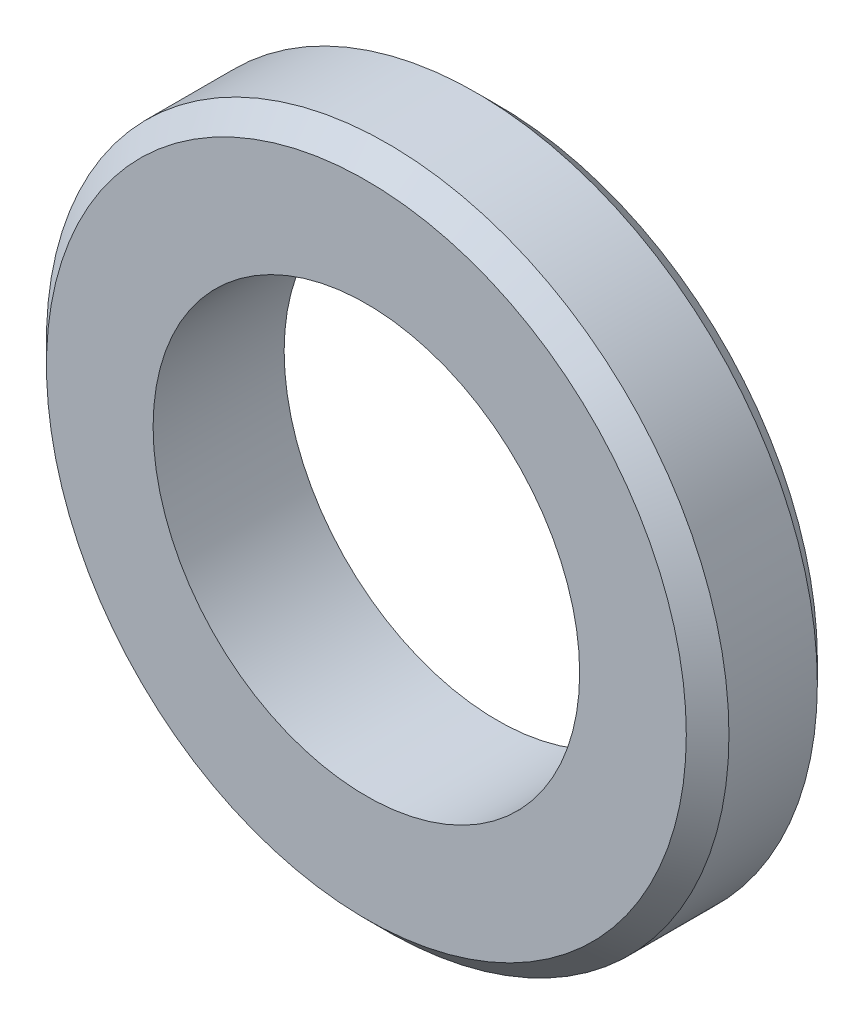
ISO-10303-21;
HEADER;
FILE_DESCRIPTION(('STEP AP214'),'2;1');
FILE_NAME('part.step','',(''),(''),'','','');
FILE_SCHEMA(('AUTOMOTIVE_DESIGN { 1 0 10303 214 1 1 1 1 }'));
ENDSEC;
DATA;
#1=APPLICATION_CONTEXT('core data for automotive mechanical design processes');
#2=APPLICATION_PROTOCOL_DEFINITION('international standard','automotive_design',2000,#1);
#3=PRODUCT_CONTEXT('',#1,'mechanical');
#4=PRODUCT('Part','Part','',(#3));
#5=PRODUCT_RELATED_PRODUCT_CATEGORY('part','',(#4));
#6=PRODUCT_DEFINITION_FORMATION('','',#4);
#7=PRODUCT_DEFINITION_CONTEXT('part definition',#1,'design');
#8=PRODUCT_DEFINITION('design','',#6,#7);
#9=PRODUCT_DEFINITION_SHAPE('','',#8);
#10=(LENGTH_UNIT() NAMED_UNIT(*) SI_UNIT(.MILLI.,.METRE.));
#11=(NAMED_UNIT(*) PLANE_ANGLE_UNIT() SI_UNIT($,.RADIAN.));
#12=(NAMED_UNIT(*) SI_UNIT($,.STERADIAN.) SOLID_ANGLE_UNIT());
#13=UNCERTAINTY_MEASURE_WITH_UNIT(LENGTH_MEASURE(1.E-05),#10,'distance_accuracy_value','');
#14=(GEOMETRIC_REPRESENTATION_CONTEXT(3) GLOBAL_UNCERTAINTY_ASSIGNED_CONTEXT((#13)) GLOBAL_UNIT_ASSIGNED_CONTEXT((#10,
#11,#12)) REPRESENTATION_CONTEXT('',''));
#15=CARTESIAN_POINT('',(0.,0.,0.));
#16=DIRECTION('',(0.,0.,1.));
#17=DIRECTION('',(1.,0.,0.));
#18=AXIS2_PLACEMENT_3D('',#15,#16,#17);
#19=CARTESIAN_POINT('',(0.,0.,4.8768));
#20=DIRECTION('',(0.,0.,1.));
#21=DIRECTION('',(1.,0.,0.));
#22=AXIS2_PLACEMENT_3D('',#19,#20,#21);
#23=PLANE('',#22);
#24=CARTESIAN_POINT('',(0.,0.,4.8768));
#25=DIRECTION('',(0.,0.,1.));
#26=DIRECTION('',(1.,0.,0.));
#27=AXIS2_PLACEMENT_3D('',#24,#25,#26);
#28=CIRCLE('',#27,11.90625);
#29=CARTESIAN_POINT('',(11.90625,0.,4.8768));
#30=VERTEX_POINT('',#29);
#31=EDGE_CURVE('E10',#30,#30,#28,.T.);
#32=ORIENTED_EDGE('',*,*,#31,.T.);
#33=EDGE_LOOP('',(#32));
#34=FACE_BOUND('',#33,.T.);
#35=CARTESIAN_POINT('',(0.,0.,4.8768));
#36=DIRECTION('',(0.,0.,1.));
#37=DIRECTION('',(1.,0.,0.));
#38=AXIS2_PLACEMENT_3D('',#35,#36,#37);
#39=CIRCLE('',#38,7.9375);
#40=CARTESIAN_POINT('',(7.9375,0.,4.8768));
#41=VERTEX_POINT('',#40);
#42=EDGE_CURVE('E63',#41,#41,#39,.T.);
#43=ORIENTED_EDGE('',*,*,#42,.F.);
#44=EDGE_LOOP('',(#43));
#45=FACE_BOUND('',#44,.T.);
#46=ADVANCED_FACE('F42',(#34,#45),#23,.T.);
#47=CARTESIAN_POINT('',(0.,0.,0.));
#48=DIRECTION('',(0.,0.,1.));
#49=DIRECTION('',(1.,0.,0.));
#50=AXIS2_PLACEMENT_3D('',#47,#48,#49);
#51=PLANE('',#50);
#52=CARTESIAN_POINT('',(0.,0.,0.));
#53=DIRECTION('',(0.,0.,1.));
#54=DIRECTION('',(1.,0.,0.));
#55=AXIS2_PLACEMENT_3D('',#52,#53,#54);
#56=CIRCLE('',#55,11.90625);
#57=CARTESIAN_POINT('',(11.90625,0.,0.));
#58=VERTEX_POINT('',#57);
#59=EDGE_CURVE('E50',#58,#58,#56,.F.);
#60=ORIENTED_EDGE('',*,*,#59,.T.);
#61=EDGE_LOOP('',(#60));
#62=FACE_BOUND('',#61,.T.);
#63=CARTESIAN_POINT('',(0.,0.,0.));
#64=DIRECTION('',(0.,0.,1.));
#65=DIRECTION('',(1.,0.,0.));
#66=AXIS2_PLACEMENT_3D('',#63,#64,#65);
#67=CIRCLE('',#66,7.9375);
#68=CARTESIAN_POINT('',(7.9375,0.,0.));
#69=VERTEX_POINT('',#68);
#70=EDGE_CURVE('E64',#69,#69,#67,.T.);
#71=ORIENTED_EDGE('',*,*,#70,.T.);
#72=EDGE_LOOP('',(#71));
#73=FACE_BOUND('',#72,.T.);
#74=ADVANCED_FACE('F74',(#62,#73),#51,.F.);
#75=CARTESIAN_POINT('',(0.,0.,4.8768));
#76=DIRECTION('',(0.,0.,-1.));
#77=DIRECTION('',(-1.,0.,0.));
#78=AXIS2_PLACEMENT_3D('',#75,#76,#77);
#79=CYLINDRICAL_SURFACE('',#78,12.7);
#80=CARTESIAN_POINT('',(0.,0.,0.793750000000005));
#81=DIRECTION('',(0.,0.,1.));
#82=DIRECTION('',(1.,0.,0.));
#83=AXIS2_PLACEMENT_3D('',#80,#81,#82);
#84=CIRCLE('',#83,12.7);
#85=CARTESIAN_POINT('',(12.7,0.,0.793750000000005));
#86=VERTEX_POINT('',#85);
#87=EDGE_CURVE('E54',#86,#86,#84,.T.);
#88=ORIENTED_EDGE('',*,*,#87,.T.);
#89=EDGE_LOOP('',(#88));
#90=FACE_BOUND('',#89,.T.);
#91=CARTESIAN_POINT('',(0.,0.,4.08304999999999));
#92=DIRECTION('',(0.,0.,1.));
#93=DIRECTION('',(1.,0.,0.));
#94=AXIS2_PLACEMENT_3D('',#91,#92,#93);
#95=CIRCLE('',#94,12.7);
#96=CARTESIAN_POINT('',(12.7,0.,4.08304999999999));
#97=VERTEX_POINT('',#96);
#98=EDGE_CURVE('E58',#97,#97,#95,.F.);
#99=ORIENTED_EDGE('',*,*,#98,.T.);
#100=EDGE_LOOP('',(#99));
#101=FACE_BOUND('',#100,.T.);
#102=ADVANCED_FACE('F80',(#90,#101),#79,.T.);
#103=CARTESIAN_POINT('',(0.,0.,4.8768));
#104=DIRECTION('',(0.,0.,-1.));
#105=DIRECTION('',(-1.,0.,0.));
#106=AXIS2_PLACEMENT_3D('',#103,#104,#105);
#107=CYLINDRICAL_SURFACE('',#106,7.9375);
#108=ORIENTED_EDGE('',*,*,#42,.T.);
#109=EDGE_LOOP('',(#108));
#110=FACE_BOUND('',#109,.T.);
#111=ORIENTED_EDGE('',*,*,#70,.F.);
#112=EDGE_LOOP('',(#111));
#113=FACE_BOUND('',#112,.T.);
#114=ADVANCED_FACE('F70',(#110,#113),#107,.F.);
#115=CARTESIAN_POINT('',(0.,0.,0.793750000000005));
#116=DIRECTION('',(0.,0.,1.));
#117=DIRECTION('',(1.,0.,0.));
#118=AXIS2_PLACEMENT_3D('',#115,#116,#117);
#119=CONICAL_SURFACE('',#118,12.7,0.785398163397449);
#120=ORIENTED_EDGE('',*,*,#59,.F.);
#121=EDGE_LOOP('',(#120));
#122=FACE_BOUND('',#121,.T.);
#123=ORIENTED_EDGE('',*,*,#87,.F.);
#124=EDGE_LOOP('',(#123));
#125=FACE_BOUND('',#124,.T.);
#126=ADVANCED_FACE('F87',(#122,#125),#119,.T.);
#127=CARTESIAN_POINT('',(0.,0.,4.8768));
#128=DIRECTION('',(0.,0.,-1.));
#129=DIRECTION('',(-1.,0.,0.));
#130=AXIS2_PLACEMENT_3D('',#127,#128,#129);
#131=CONICAL_SURFACE('',#130,11.90625,0.785398163397445);
#132=ORIENTED_EDGE('',*,*,#98,.F.);
#133=EDGE_LOOP('',(#132));
#134=FACE_BOUND('',#133,.T.);
#135=ORIENTED_EDGE('',*,*,#31,.F.);
#136=EDGE_LOOP('',(#135));
#137=FACE_BOUND('',#136,.T.);
#138=ADVANCED_FACE('F45',(#134,#137),#131,.T.);
#139=CLOSED_SHELL('',(#46,#74,#102,#114,#126,#138));
#140=MANIFOLD_SOLID_BREP('B2',#139);
#141=ADVANCED_BREP_SHAPE_REPRESENTATION('',(#18,#140),#14);
#142=SHAPE_DEFINITION_REPRESENTATION(#9,#141);
ENDSEC;
END-ISO-10303-21;
